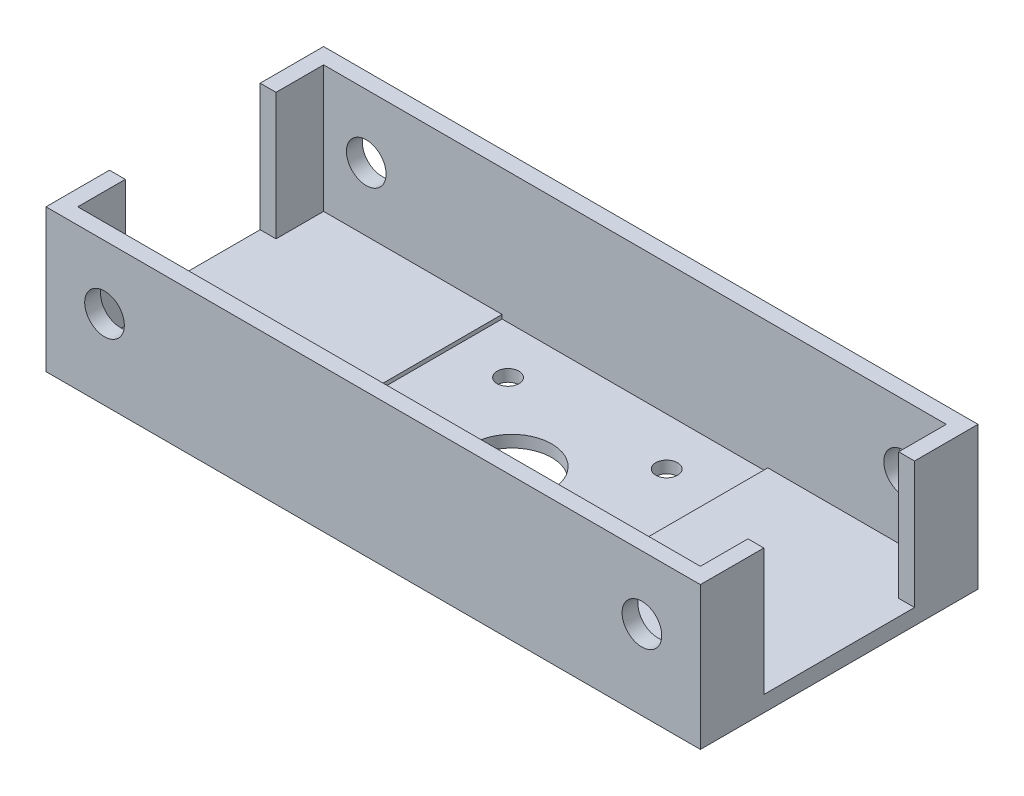
ISO-10303-21;
HEADER;
FILE_DESCRIPTION(('STEP AP214'),'2;1');
FILE_NAME('part.step','',(''),(''),'','','');
FILE_SCHEMA(('AUTOMOTIVE_DESIGN { 1 0 10303 214 1 1 1 1 }'));
ENDSEC;
DATA;
#1=APPLICATION_CONTEXT('core data for automotive mechanical design processes');
#2=APPLICATION_PROTOCOL_DEFINITION('international standard','automotive_design',2000,#1);
#3=PRODUCT_CONTEXT('',#1,'mechanical');
#4=PRODUCT('Part','Part','',(#3));
#5=PRODUCT_RELATED_PRODUCT_CATEGORY('part','',(#4));
#6=PRODUCT_DEFINITION_FORMATION('','',#4);
#7=PRODUCT_DEFINITION_CONTEXT('part definition',#1,'design');
#8=PRODUCT_DEFINITION('design','',#6,#7);
#9=PRODUCT_DEFINITION_SHAPE('','',#8);
#10=(LENGTH_UNIT() NAMED_UNIT(*) SI_UNIT(.MILLI.,.METRE.));
#11=(NAMED_UNIT(*) PLANE_ANGLE_UNIT() SI_UNIT($,.RADIAN.));
#12=(NAMED_UNIT(*) SI_UNIT($,.STERADIAN.) SOLID_ANGLE_UNIT());
#13=UNCERTAINTY_MEASURE_WITH_UNIT(LENGTH_MEASURE(1.E-05),#10,'distance_accuracy_value','');
#14=(GEOMETRIC_REPRESENTATION_CONTEXT(3) GLOBAL_UNCERTAINTY_ASSIGNED_CONTEXT((#13)) GLOBAL_UNIT_ASSIGNED_CONTEXT((#10,
#11,#12)) REPRESENTATION_CONTEXT('',''));
#15=CARTESIAN_POINT('',(0.,0.,0.));
#16=DIRECTION('',(0.,0.,1.));
#17=DIRECTION('',(1.,0.,0.));
#18=AXIS2_PLACEMENT_3D('',#15,#16,#17);
#19=CARTESIAN_POINT('',(0.,83.,0.));
#20=DIRECTION('',(0.,-1.,0.));
#21=DIRECTION('',(0.,0.,-1.));
#22=AXIS2_PLACEMENT_3D('',#19,#20,#21);
#23=PLANE('',#22);
#24=CARTESIAN_POINT('',(20.,83.,-19.));
#25=DIRECTION('',(0.,1.,0.));
#26=DIRECTION('',(0.,0.,-1.));
#27=AXIS2_PLACEMENT_3D('',#24,#25,#26);
#28=CIRCLE('',#27,2.75);
#29=CARTESIAN_POINT('',(20.,83.,-21.75));
#30=VERTEX_POINT('',#29);
#31=EDGE_CURVE('E887',#30,#30,#28,.T.);
#32=ORIENTED_EDGE('',*,*,#31,.F.);
#33=EDGE_LOOP('',(#32));
#34=FACE_BOUND('',#33,.T.);
#35=CARTESIAN_POINT('',(20.,83.,19.));
#36=DIRECTION('',(0.,1.,0.));
#37=DIRECTION('',(0.,0.,-1.));
#38=AXIS2_PLACEMENT_3D('',#35,#36,#37);
#39=CIRCLE('',#38,2.75);
#40=CARTESIAN_POINT('',(20.,83.,16.25));
#41=VERTEX_POINT('',#40);
#42=EDGE_CURVE('E895',#41,#41,#39,.T.);
#43=ORIENTED_EDGE('',*,*,#42,.F.);
#44=EDGE_LOOP('',(#43));
#45=FACE_BOUND('',#44,.T.);
#46=CARTESIAN_POINT('',(-20.,83.,-19.));
#47=DIRECTION('',(0.,1.,0.));
#48=DIRECTION('',(0.,0.,1.));
#49=AXIS2_PLACEMENT_3D('',#46,#47,#48);
#50=CIRCLE('',#49,2.75);
#51=CARTESIAN_POINT('',(-20.,83.,-16.25));
#52=VERTEX_POINT('',#51);
#53=EDGE_CURVE('E903',#52,#52,#50,.T.);
#54=ORIENTED_EDGE('',*,*,#53,.F.);
#55=EDGE_LOOP('',(#54));
#56=FACE_BOUND('',#55,.T.);
#57=CARTESIAN_POINT('',(-20.,83.,19.));
#58=DIRECTION('',(0.,1.,0.));
#59=DIRECTION('',(0.,0.,1.));
#60=AXIS2_PLACEMENT_3D('',#57,#58,#59);
#61=CIRCLE('',#60,2.75);
#62=CARTESIAN_POINT('',(-20.,83.,21.75));
#63=VERTEX_POINT('',#62);
#64=EDGE_CURVE('E841',#63,#63,#61,.T.);
#65=ORIENTED_EDGE('',*,*,#64,.F.);
#66=EDGE_LOOP('',(#65));
#67=FACE_BOUND('',#66,.T.);
#68=DIRECTION('',(0.,0.,-1.));
#69=VECTOR('',#68,1.);
#70=CARTESIAN_POINT('',(-33.5,83.,31.));
#71=LINE('',#70,#69);
#72=CARTESIAN_POINT('',(-33.5,83.,31.));
#73=VERTEX_POINT('',#72);
#74=CARTESIAN_POINT('',(-33.5,83.,-31.));
#75=VERTEX_POINT('',#74);
#76=EDGE_CURVE('E63',#73,#75,#71,.T.);
#77=ORIENTED_EDGE('',*,*,#76,.F.);
#78=DIRECTION('',(-1.,0.,0.));
#79=VECTOR('',#78,1.);
#80=CARTESIAN_POINT('',(-33.5,83.,31.));
#81=LINE('',#80,#79);
#82=CARTESIAN_POINT('',(33.5,83.,31.));
#83=VERTEX_POINT('',#82);
#84=EDGE_CURVE('E517',#83,#73,#81,.T.);
#85=ORIENTED_EDGE('',*,*,#84,.F.);
#86=DIRECTION('',(0.,0.,1.));
#87=VECTOR('',#86,1.);
#88=CARTESIAN_POINT('',(33.5,83.,31.));
#89=LINE('',#88,#87);
#90=CARTESIAN_POINT('',(33.5,83.,-31.));
#91=VERTEX_POINT('',#90);
#92=EDGE_CURVE('E186',#91,#83,#89,.T.);
#93=ORIENTED_EDGE('',*,*,#92,.F.);
#94=DIRECTION('',(1.,0.,0.));
#95=VECTOR('',#94,1.);
#96=CARTESIAN_POINT('',(-33.5,83.,-31.));
#97=LINE('',#96,#95);
#98=EDGE_CURVE('E183',#75,#91,#97,.T.);
#99=ORIENTED_EDGE('',*,*,#98,.F.);
#100=EDGE_LOOP('',(#77,#85,#93,#99));
#101=FACE_BOUND('',#100,.T.);
#102=CARTESIAN_POINT('',(0.,83.,0.));
#103=DIRECTION('',(0.,1.,0.));
#104=DIRECTION('',(0.,0.,1.));
#105=AXIS2_PLACEMENT_3D('',#102,#103,#104);
#106=CIRCLE('',#105,10.);
#107=CARTESIAN_POINT('',(0.,83.,10.));
#108=VERTEX_POINT('',#107);
#109=EDGE_CURVE('E839',#108,#108,#106,.T.);
#110=ORIENTED_EDGE('',*,*,#109,.F.);
#111=EDGE_LOOP('',(#110));
#112=FACE_BOUND('',#111,.T.);
#113=ADVANCED_FACE('F47',(#34,#45,#56,#67,#101,#112),#23,.F.);
#114=CARTESIAN_POINT('',(-33.5,0.,-14.));
#115=DIRECTION('',(-1.,0.,0.));
#116=DIRECTION('',(0.,0.,1.));
#117=AXIS2_PLACEMENT_3D('',#114,#115,#116);
#118=PLANE('',#117);
#119=ORIENTED_EDGE('',*,*,#76,.T.);
#120=DIRECTION('',(0.,-1.,0.));
#121=VECTOR('',#120,1.);
#122=CARTESIAN_POINT('',(-33.5,113.,-31.));
#123=LINE('',#122,#121);
#124=CARTESIAN_POINT('',(-33.5,84.,-31.));
#125=VERTEX_POINT('',#124);
#126=EDGE_CURVE('E197',#125,#75,#123,.T.);
#127=ORIENTED_EDGE('',*,*,#126,.F.);
#128=DIRECTION('',(0.,0.,-1.));
#129=VECTOR('',#128,1.);
#130=CARTESIAN_POINT('',(-33.5,84.,-31.));
#131=LINE('',#130,#129);
#132=CARTESIAN_POINT('',(-33.5,84.,31.));
#133=VERTEX_POINT('',#132);
#134=EDGE_CURVE('E350',#133,#125,#131,.T.);
#135=ORIENTED_EDGE('',*,*,#134,.F.);
#136=DIRECTION('',(0.,-1.,0.));
#137=VECTOR('',#136,1.);
#138=CARTESIAN_POINT('',(-33.5,113.,31.));
#139=LINE('',#138,#137);
#140=EDGE_CURVE('E199',#133,#73,#139,.T.);
#141=ORIENTED_EDGE('',*,*,#140,.T.);
#142=EDGE_LOOP('',(#119,#127,#135,#141));
#143=FACE_BOUND('',#142,.T.);
#144=ADVANCED_FACE('F49',(#143),#118,.F.);
#145=CARTESIAN_POINT('',(33.5,0.,-14.));
#146=DIRECTION('',(1.,0.,0.));
#147=DIRECTION('',(0.,0.,-1.));
#148=AXIS2_PLACEMENT_3D('',#145,#146,#147);
#149=PLANE('',#148);
#150=ORIENTED_EDGE('',*,*,#92,.T.);
#151=DIRECTION('',(0.,-1.,0.));
#152=VECTOR('',#151,1.);
#153=CARTESIAN_POINT('',(33.5,113.,31.));
#154=LINE('',#153,#152);
#155=CARTESIAN_POINT('',(33.5,84.,31.));
#156=VERTEX_POINT('',#155);
#157=EDGE_CURVE('E208',#156,#83,#154,.T.);
#158=ORIENTED_EDGE('',*,*,#157,.F.);
#159=DIRECTION('',(0.,0.,1.));
#160=VECTOR('',#159,1.);
#161=CARTESIAN_POINT('',(33.5,84.,31.));
#162=LINE('',#161,#160);
#163=CARTESIAN_POINT('',(33.5,84.,-31.));
#164=VERTEX_POINT('',#163);
#165=EDGE_CURVE('E353',#164,#156,#162,.T.);
#166=ORIENTED_EDGE('',*,*,#165,.F.);
#167=DIRECTION('',(0.,-1.,0.));
#168=VECTOR('',#167,1.);
#169=CARTESIAN_POINT('',(33.5,113.,-31.));
#170=LINE('',#169,#168);
#171=EDGE_CURVE('E209',#164,#91,#170,.T.);
#172=ORIENTED_EDGE('',*,*,#171,.T.);
#173=EDGE_LOOP('',(#150,#158,#166,#172));
#174=FACE_BOUND('',#173,.T.);
#175=ADVANCED_FACE('F463',(#174),#149,.F.);
#176=CARTESIAN_POINT('',(33.5,113.,-31.));
#177=DIRECTION('',(0.,0.,1.));
#178=DIRECTION('',(1.,0.,0.));
#179=AXIS2_PLACEMENT_3D('',#176,#177,#178);
#180=PLANE('',#179);
#181=CARTESIAN_POINT('',(-67.75,100.,-31.));
#182=DIRECTION('',(0.,0.,1.));
#183=DIRECTION('',(1.,0.,0.));
#184=AXIS2_PLACEMENT_3D('',#181,#182,#183);
#185=CIRCLE('',#184,5.00000000000001);
#186=CARTESIAN_POINT('',(-62.75,100.,-31.));
#187=VERTEX_POINT('',#186);
#188=EDGE_CURVE('E229',#187,#187,#185,.F.);
#189=ORIENTED_EDGE('',*,*,#188,.T.);
#190=EDGE_LOOP('',(#189));
#191=FACE_BOUND('',#190,.T.);
#192=CARTESIAN_POINT('',(67.75,100.,-31.));
#193=DIRECTION('',(0.,0.,1.));
#194=DIRECTION('',(1.,0.,0.));
#195=AXIS2_PLACEMENT_3D('',#192,#193,#194);
#196=CIRCLE('',#195,5.00000000000001);
#197=CARTESIAN_POINT('',(72.75,100.,-31.));
#198=VERTEX_POINT('',#197);
#199=EDGE_CURVE('E223',#198,#198,#196,.T.);
#200=ORIENTED_EDGE('',*,*,#199,.F.);
#201=EDGE_LOOP('',(#200));
#202=FACE_BOUND('',#201,.T.);
#203=ORIENTED_EDGE('',*,*,#126,.T.);
#204=ORIENTED_EDGE('',*,*,#98,.T.);
#205=ORIENTED_EDGE('',*,*,#171,.F.);
#206=DIRECTION('',(-1.,0.,0.));
#207=VECTOR('',#206,1.);
#208=CARTESIAN_POINT('',(33.5,84.,-31.));
#209=LINE('',#208,#207);
#210=CARTESIAN_POINT('',(78.5,84.,-31.));
#211=VERTEX_POINT('',#210);
#212=EDGE_CURVE('E373',#211,#164,#209,.T.);
#213=ORIENTED_EDGE('',*,*,#212,.F.);
#214=DIRECTION('',(0.,1.,0.));
#215=VECTOR('',#214,1.);
#216=CARTESIAN_POINT('',(78.5,84.,-31.));
#217=LINE('',#216,#215);
#218=CARTESIAN_POINT('',(78.5,116.,-31.));
#219=VERTEX_POINT('',#218);
#220=EDGE_CURVE('E346',#211,#219,#217,.T.);
#221=ORIENTED_EDGE('',*,*,#220,.T.);
#222=DIRECTION('',(-1.,0.,0.));
#223=VECTOR('',#222,1.);
#224=CARTESIAN_POINT('',(-78.5,116.,-31.));
#225=LINE('',#224,#223);
#226=CARTESIAN_POINT('',(-78.5,116.,-31.));
#227=VERTEX_POINT('',#226);
#228=EDGE_CURVE('E276',#219,#227,#225,.T.);
#229=ORIENTED_EDGE('',*,*,#228,.T.);
#230=DIRECTION('',(0.,1.,0.));
#231=VECTOR('',#230,1.);
#232=CARTESIAN_POINT('',(-78.5,84.,-31.));
#233=LINE('',#232,#231);
#234=CARTESIAN_POINT('',(-78.5,84.,-31.));
#235=VERTEX_POINT('',#234);
#236=EDGE_CURVE('E258',#235,#227,#233,.T.);
#237=ORIENTED_EDGE('',*,*,#236,.F.);
#238=DIRECTION('',(-1.,0.,0.));
#239=VECTOR('',#238,1.);
#240=CARTESIAN_POINT('',(-33.5,84.,-31.));
#241=LINE('',#240,#239);
#242=EDGE_CURVE('E206',#125,#235,#241,.T.);
#243=ORIENTED_EDGE('',*,*,#242,.F.);
#244=EDGE_LOOP('',(#203,#204,#205,#213,#221,#229,#237,#243));
#245=FACE_BOUND('',#244,.T.);
#246=ADVANCED_FACE('F204',(#191,#202,#245),#180,.T.);
#247=CARTESIAN_POINT('',(-33.5,113.,31.));
#248=DIRECTION('',(0.,0.,-1.));
#249=DIRECTION('',(-1.,0.,0.));
#250=AXIS2_PLACEMENT_3D('',#247,#248,#249);
#251=PLANE('',#250);
#252=CARTESIAN_POINT('',(-67.75,100.,31.));
#253=DIRECTION('',(0.,0.,-1.));
#254=DIRECTION('',(-1.,0.,0.));
#255=AXIS2_PLACEMENT_3D('',#252,#253,#254);
#256=CIRCLE('',#255,5.00000000000001);
#257=CARTESIAN_POINT('',(-72.75,100.,31.));
#258=VERTEX_POINT('',#257);
#259=EDGE_CURVE('E225',#258,#258,#256,.F.);
#260=ORIENTED_EDGE('',*,*,#259,.T.);
#261=EDGE_LOOP('',(#260));
#262=FACE_BOUND('',#261,.T.);
#263=CARTESIAN_POINT('',(67.75,100.,31.));
#264=DIRECTION('',(0.,0.,-1.));
#265=DIRECTION('',(-1.,0.,0.));
#266=AXIS2_PLACEMENT_3D('',#263,#264,#265);
#267=CIRCLE('',#266,5.00000000000001);
#268=CARTESIAN_POINT('',(62.75,100.,31.));
#269=VERTEX_POINT('',#268);
#270=EDGE_CURVE('E219',#269,#269,#267,.T.);
#271=ORIENTED_EDGE('',*,*,#270,.F.);
#272=EDGE_LOOP('',(#271));
#273=FACE_BOUND('',#272,.T.);
#274=ORIENTED_EDGE('',*,*,#157,.T.);
#275=ORIENTED_EDGE('',*,*,#84,.T.);
#276=ORIENTED_EDGE('',*,*,#140,.F.);
#277=DIRECTION('',(1.,0.,0.));
#278=VECTOR('',#277,1.);
#279=CARTESIAN_POINT('',(-33.5,84.,31.));
#280=LINE('',#279,#278);
#281=CARTESIAN_POINT('',(-78.5,84.,31.));
#282=VERTEX_POINT('',#281);
#283=EDGE_CURVE('E360',#282,#133,#280,.T.);
#284=ORIENTED_EDGE('',*,*,#283,.F.);
#285=DIRECTION('',(0.,1.,0.));
#286=VECTOR('',#285,1.);
#287=CARTESIAN_POINT('',(-78.5,84.,31.));
#288=LINE('',#287,#286);
#289=CARTESIAN_POINT('',(-78.5,116.,31.));
#290=VERTEX_POINT('',#289);
#291=EDGE_CURVE('E363',#282,#290,#288,.T.);
#292=ORIENTED_EDGE('',*,*,#291,.T.);
#293=DIRECTION('',(1.,0.,0.));
#294=VECTOR('',#293,1.);
#295=CARTESIAN_POINT('',(-78.5,116.,31.));
#296=LINE('',#295,#294);
#297=CARTESIAN_POINT('',(78.5,116.,31.));
#298=VERTEX_POINT('',#297);
#299=EDGE_CURVE('E261',#290,#298,#296,.T.);
#300=ORIENTED_EDGE('',*,*,#299,.T.);
#301=DIRECTION('',(0.,1.,0.));
#302=VECTOR('',#301,1.);
#303=CARTESIAN_POINT('',(78.5,84.,31.));
#304=LINE('',#303,#302);
#305=CARTESIAN_POINT('',(78.5,84.,31.));
#306=VERTEX_POINT('',#305);
#307=EDGE_CURVE('E370',#306,#298,#304,.T.);
#308=ORIENTED_EDGE('',*,*,#307,.F.);
#309=DIRECTION('',(1.,0.,0.));
#310=VECTOR('',#309,1.);
#311=CARTESIAN_POINT('',(33.5,84.,31.));
#312=LINE('',#311,#310);
#313=EDGE_CURVE('E384',#156,#306,#312,.T.);
#314=ORIENTED_EDGE('',*,*,#313,.F.);
#315=EDGE_LOOP('',(#274,#275,#276,#284,#292,#300,#308,#314));
#316=FACE_BOUND('',#315,.T.);
#317=ADVANCED_FACE('F431',(#262,#273,#316),#251,.T.);
#318=CARTESIAN_POINT('',(-82.5,0.,0.));
#319=DIRECTION('',(-1.,0.,0.));
#320=DIRECTION('',(0.,0.,1.));
#321=AXIS2_PLACEMENT_3D('',#318,#319,#320);
#322=PLANE('',#321);
#323=DIRECTION('',(0.,0.,1.));
#324=VECTOR('',#323,1.);
#325=CARTESIAN_POINT('',(-82.5,116.,-35.));
#326=LINE('',#325,#324);
#327=CARTESIAN_POINT('',(-82.5,116.,19.));
#328=VERTEX_POINT('',#327);
#329=CARTESIAN_POINT('',(-82.5,116.,35.));
#330=VERTEX_POINT('',#329);
#331=EDGE_CURVE('E279',#328,#330,#326,.T.);
#332=ORIENTED_EDGE('',*,*,#331,.F.);
#333=DIRECTION('',(0.,1.,0.));
#334=VECTOR('',#333,1.);
#335=CARTESIAN_POINT('',(-82.5,84.,19.));
#336=LINE('',#335,#334);
#337=CARTESIAN_POINT('',(-82.5,84.,19.));
#338=VERTEX_POINT('',#337);
#339=EDGE_CURVE('E71',#338,#328,#336,.T.);
#340=ORIENTED_EDGE('',*,*,#339,.F.);
#341=DIRECTION('',(0.,0.,1.));
#342=VECTOR('',#341,1.);
#343=CARTESIAN_POINT('',(-82.5,84.,-19.));
#344=LINE('',#343,#342);
#345=CARTESIAN_POINT('',(-82.5,84.,-19.));
#346=VERTEX_POINT('',#345);
#347=EDGE_CURVE('E309',#346,#338,#344,.T.);
#348=ORIENTED_EDGE('',*,*,#347,.F.);
#349=DIRECTION('',(0.,-1.,0.));
#350=VECTOR('',#349,1.);
#351=CARTESIAN_POINT('',(-82.5,84.,-19.));
#352=LINE('',#351,#350);
#353=CARTESIAN_POINT('',(-82.5,116.,-19.));
#354=VERTEX_POINT('',#353);
#355=EDGE_CURVE('E294',#354,#346,#352,.T.);
#356=ORIENTED_EDGE('',*,*,#355,.F.);
#357=CARTESIAN_POINT('',(-82.5,116.,-35.));
#358=VERTEX_POINT('',#357);
#359=EDGE_CURVE('E250',#358,#354,#326,.T.);
#360=ORIENTED_EDGE('',*,*,#359,.F.);
#361=DIRECTION('',(0.,-1.,0.));
#362=VECTOR('',#361,1.);
#363=CARTESIAN_POINT('',(-82.5,113.,-35.));
#364=LINE('',#363,#362);
#365=CARTESIAN_POINT('',(-82.5,80.,-35.));
#366=VERTEX_POINT('',#365);
#367=EDGE_CURVE('E396',#358,#366,#364,.T.);
#368=ORIENTED_EDGE('',*,*,#367,.T.);
#369=DIRECTION('',(0.,0.,1.));
#370=VECTOR('',#369,1.);
#371=CARTESIAN_POINT('',(-82.5,80.,-35.));
#372=LINE('',#371,#370);
#373=CARTESIAN_POINT('',(-82.5,80.,35.));
#374=VERTEX_POINT('',#373);
#375=EDGE_CURVE('E339',#366,#374,#372,.T.);
#376=ORIENTED_EDGE('',*,*,#375,.T.);
#377=DIRECTION('',(0.,1.,0.));
#378=VECTOR('',#377,1.);
#379=CARTESIAN_POINT('',(-82.5,113.,35.));
#380=LINE('',#379,#378);
#381=EDGE_CURVE('E215',#374,#330,#380,.T.);
#382=ORIENTED_EDGE('',*,*,#381,.T.);
#383=EDGE_LOOP('',(#332,#340,#348,#356,#360,#368,#376,#382));
#384=FACE_BOUND('',#383,.T.);
#385=ADVANCED_FACE('F407',(#384),#322,.T.);
#386=CARTESIAN_POINT('',(-78.5,84.,-31.));
#387=DIRECTION('',(-1.,0.,0.));
#388=DIRECTION('',(0.,0.,1.));
#389=AXIS2_PLACEMENT_3D('',#386,#387,#388);
#390=PLANE('',#389);
#391=DIRECTION('',(0.,1.,0.));
#392=VECTOR('',#391,1.);
#393=CARTESIAN_POINT('',(-78.5,84.,19.));
#394=LINE('',#393,#392);
#395=CARTESIAN_POINT('',(-78.5,84.,19.));
#396=VERTEX_POINT('',#395);
#397=CARTESIAN_POINT('',(-78.5,116.,19.));
#398=VERTEX_POINT('',#397);
#399=EDGE_CURVE('E318',#396,#398,#394,.T.);
#400=ORIENTED_EDGE('',*,*,#399,.T.);
#401=DIRECTION('',(0.,0.,1.));
#402=VECTOR('',#401,1.);
#403=CARTESIAN_POINT('',(-78.5,116.,-31.));
#404=LINE('',#403,#402);
#405=EDGE_CURVE('E262',#398,#290,#404,.T.);
#406=ORIENTED_EDGE('',*,*,#405,.T.);
#407=ORIENTED_EDGE('',*,*,#291,.F.);
#408=DIRECTION('',(0.,0.,1.));
#409=VECTOR('',#408,1.);
#410=CARTESIAN_POINT('',(-78.5,84.,-31.));
#411=LINE('',#410,#409);
#412=EDGE_CURVE('E356',#396,#282,#411,.T.);
#413=ORIENTED_EDGE('',*,*,#412,.F.);
#414=EDGE_LOOP('',(#400,#406,#407,#413));
#415=FACE_BOUND('',#414,.T.);
#416=ADVANCED_FACE('F435',(#415),#390,.F.);
#417=CARTESIAN_POINT('',(-78.5,116.,-19.));
#418=VERTEX_POINT('',#417);
#419=EDGE_CURVE('E247',#227,#418,#404,.T.);
#420=ORIENTED_EDGE('',*,*,#419,.T.);
#421=DIRECTION('',(0.,-1.,0.));
#422=VECTOR('',#421,1.);
#423=CARTESIAN_POINT('',(-78.5,84.,-19.));
#424=LINE('',#423,#422);
#425=CARTESIAN_POINT('',(-78.5,84.,-19.));
#426=VERTEX_POINT('',#425);
#427=EDGE_CURVE('E256',#418,#426,#424,.T.);
#428=ORIENTED_EDGE('',*,*,#427,.T.);
#429=EDGE_CURVE('E357',#235,#426,#411,.T.);
#430=ORIENTED_EDGE('',*,*,#429,.F.);
#431=ORIENTED_EDGE('',*,*,#236,.T.);
#432=EDGE_LOOP('',(#420,#428,#430,#431));
#433=FACE_BOUND('',#432,.T.);
#434=ADVANCED_FACE('F254',(#433),#390,.F.);
#435=CARTESIAN_POINT('',(0.,116.,0.));
#436=DIRECTION('',(0.,1.,0.));
#437=DIRECTION('',(0.,0.,1.));
#438=AXIS2_PLACEMENT_3D('',#435,#436,#437);
#439=PLANE('',#438);
#440=ORIENTED_EDGE('',*,*,#405,.F.);
#441=DIRECTION('',(-1.,0.,0.));
#442=VECTOR('',#441,1.);
#443=CARTESIAN_POINT('',(0.,116.,19.));
#444=LINE('',#443,#442);
#445=EDGE_CURVE('E11',#398,#328,#444,.T.);
#446=ORIENTED_EDGE('',*,*,#445,.T.);
#447=ORIENTED_EDGE('',*,*,#331,.T.);
#448=DIRECTION('',(1.,0.,0.));
#449=VECTOR('',#448,1.);
#450=CARTESIAN_POINT('',(-82.5,116.,35.));
#451=LINE('',#450,#449);
#452=CARTESIAN_POINT('',(82.5,116.,35.));
#453=VERTEX_POINT('',#452);
#454=EDGE_CURVE('E282',#330,#453,#451,.T.);
#455=ORIENTED_EDGE('',*,*,#454,.T.);
#456=DIRECTION('',(0.,0.,-1.));
#457=VECTOR('',#456,1.);
#458=CARTESIAN_POINT('',(82.5,116.,-35.));
#459=LINE('',#458,#457);
#460=CARTESIAN_POINT('',(82.5,116.,19.));
#461=VERTEX_POINT('',#460);
#462=EDGE_CURVE('E287',#453,#461,#459,.T.);
#463=ORIENTED_EDGE('',*,*,#462,.T.);
#464=DIRECTION('',(1.,0.,0.));
#465=VECTOR('',#464,1.);
#466=CARTESIAN_POINT('',(0.,116.,19.));
#467=LINE('',#466,#465);
#468=CARTESIAN_POINT('',(78.5,116.,19.));
#469=VERTEX_POINT('',#468);
#470=EDGE_CURVE('E235',#469,#461,#467,.T.);
#471=ORIENTED_EDGE('',*,*,#470,.F.);
#472=DIRECTION('',(0.,0.,-1.));
#473=VECTOR('',#472,1.);
#474=CARTESIAN_POINT('',(78.5,116.,-31.));
#475=LINE('',#474,#473);
#476=EDGE_CURVE('E272',#298,#469,#475,.T.);
#477=ORIENTED_EDGE('',*,*,#476,.F.);
#478=ORIENTED_EDGE('',*,*,#299,.F.);
#479=EDGE_LOOP('',(#440,#446,#447,#455,#463,#471,#477,#478));
#480=FACE_BOUND('',#479,.T.);
#481=ADVANCED_FACE('F415',(#480),#439,.T.);
#482=ORIENTED_EDGE('',*,*,#359,.T.);
#483=DIRECTION('',(1.,0.,0.));
#484=VECTOR('',#483,1.);
#485=CARTESIAN_POINT('',(0.,116.,-19.));
#486=LINE('',#485,#484);
#487=EDGE_CURVE('E56',#354,#418,#486,.T.);
#488=ORIENTED_EDGE('',*,*,#487,.T.);
#489=ORIENTED_EDGE('',*,*,#419,.F.);
#490=ORIENTED_EDGE('',*,*,#228,.F.);
#491=CARTESIAN_POINT('',(78.5,116.,-19.));
#492=VERTEX_POINT('',#491);
#493=EDGE_CURVE('E267',#492,#219,#475,.T.);
#494=ORIENTED_EDGE('',*,*,#493,.F.);
#495=DIRECTION('',(-1.,0.,0.));
#496=VECTOR('',#495,1.);
#497=CARTESIAN_POINT('',(0.,116.,-19.));
#498=LINE('',#497,#496);
#499=CARTESIAN_POINT('',(82.5,116.,-19.));
#500=VERTEX_POINT('',#499);
#501=EDGE_CURVE('E231',#500,#492,#498,.T.);
#502=ORIENTED_EDGE('',*,*,#501,.F.);
#503=CARTESIAN_POINT('',(82.5,116.,-35.));
#504=VERTEX_POINT('',#503);
#505=EDGE_CURVE('E286',#500,#504,#459,.T.);
#506=ORIENTED_EDGE('',*,*,#505,.T.);
#507=DIRECTION('',(-1.,0.,0.));
#508=VECTOR('',#507,1.);
#509=CARTESIAN_POINT('',(-82.5,116.,-35.));
#510=LINE('',#509,#508);
#511=EDGE_CURVE('E291',#504,#358,#510,.T.);
#512=ORIENTED_EDGE('',*,*,#511,.T.);
#513=EDGE_LOOP('',(#482,#488,#489,#490,#494,#502,#506,#512));
#514=FACE_BOUND('',#513,.T.);
#515=ADVANCED_FACE('F245',(#514),#439,.T.);
#516=CARTESIAN_POINT('',(78.5,84.,31.));
#517=DIRECTION('',(1.,0.,0.));
#518=DIRECTION('',(0.,0.,-1.));
#519=AXIS2_PLACEMENT_3D('',#516,#517,#518);
#520=PLANE('',#519);
#521=ORIENTED_EDGE('',*,*,#476,.T.);
#522=DIRECTION('',(0.,-1.,0.));
#523=VECTOR('',#522,1.);
#524=CARTESIAN_POINT('',(78.5,84.,19.));
#525=LINE('',#524,#523);
#526=CARTESIAN_POINT('',(78.5,84.,19.));
#527=VERTEX_POINT('',#526);
#528=EDGE_CURVE('E325',#469,#527,#525,.T.);
#529=ORIENTED_EDGE('',*,*,#528,.T.);
#530=DIRECTION('',(0.,0.,-1.));
#531=VECTOR('',#530,1.);
#532=CARTESIAN_POINT('',(78.5,84.,31.));
#533=LINE('',#532,#531);
#534=EDGE_CURVE('E380',#306,#527,#533,.T.);
#535=ORIENTED_EDGE('',*,*,#534,.F.);
#536=ORIENTED_EDGE('',*,*,#307,.T.);
#537=EDGE_LOOP('',(#521,#529,#535,#536));
#538=FACE_BOUND('',#537,.T.);
#539=ADVANCED_FACE('F427',(#538),#520,.F.);
#540=CARTESIAN_POINT('',(0.,84.,0.));
#541=DIRECTION('',(0.,-1.,0.));
#542=DIRECTION('',(0.,0.,-1.));
#543=AXIS2_PLACEMENT_3D('',#540,#541,#542);
#544=PLANE('',#543);
#545=ORIENTED_EDGE('',*,*,#165,.T.);
#546=ORIENTED_EDGE('',*,*,#313,.T.);
#547=ORIENTED_EDGE('',*,*,#534,.T.);
#548=DIRECTION('',(-1.,0.,0.));
#549=VECTOR('',#548,1.);
#550=CARTESIAN_POINT('',(82.5,84.,19.));
#551=LINE('',#550,#549);
#552=CARTESIAN_POINT('',(82.5,84.,19.));
#553=VERTEX_POINT('',#552);
#554=EDGE_CURVE('E315',#553,#527,#551,.T.);
#555=ORIENTED_EDGE('',*,*,#554,.F.);
#556=DIRECTION('',(0.,0.,1.));
#557=VECTOR('',#556,1.);
#558=CARTESIAN_POINT('',(82.5,84.,-19.));
#559=LINE('',#558,#557);
#560=CARTESIAN_POINT('',(82.5,84.,-19.));
#561=VERTEX_POINT('',#560);
#562=EDGE_CURVE('E299',#561,#553,#559,.T.);
#563=ORIENTED_EDGE('',*,*,#562,.F.);
#564=DIRECTION('',(-1.,0.,0.));
#565=VECTOR('',#564,1.);
#566=CARTESIAN_POINT('',(82.5,84.,-19.));
#567=LINE('',#566,#565);
#568=CARTESIAN_POINT('',(78.5,84.,-19.));
#569=VERTEX_POINT('',#568);
#570=EDGE_CURVE('E320',#561,#569,#567,.T.);
#571=ORIENTED_EDGE('',*,*,#570,.T.);
#572=EDGE_CURVE('E379',#569,#211,#533,.T.);
#573=ORIENTED_EDGE('',*,*,#572,.T.);
#574=ORIENTED_EDGE('',*,*,#212,.T.);
#575=EDGE_LOOP('',(#545,#546,#547,#555,#563,#571,#573,#574));
#576=FACE_BOUND('',#575,.T.);
#577=ADVANCED_FACE('F492',(#576),#544,.F.);
#578=CARTESIAN_POINT('',(0.,0.,35.));
#579=DIRECTION('',(0.,0.,1.));
#580=DIRECTION('',(1.,0.,0.));
#581=AXIS2_PLACEMENT_3D('',#578,#579,#580);
#582=PLANE('',#581);
#583=DIRECTION('',(-1.,0.,0.));
#584=VECTOR('',#583,1.);
#585=CARTESIAN_POINT('',(-82.5,80.,35.));
#586=LINE('',#585,#584);
#587=CARTESIAN_POINT('',(82.5,80.,35.));
#588=VERTEX_POINT('',#587);
#589=EDGE_CURVE('E340',#588,#374,#586,.T.);
#590=ORIENTED_EDGE('',*,*,#589,.F.);
#591=DIRECTION('',(0.,1.,0.));
#592=VECTOR('',#591,1.);
#593=CARTESIAN_POINT('',(82.5,113.,35.));
#594=LINE('',#593,#592);
#595=EDGE_CURVE('E393',#588,#453,#594,.T.);
#596=ORIENTED_EDGE('',*,*,#595,.T.);
#597=ORIENTED_EDGE('',*,*,#454,.F.);
#598=ORIENTED_EDGE('',*,*,#381,.F.);
#599=EDGE_LOOP('',(#590,#596,#597,#598));
#600=FACE_BOUND('',#599,.T.);
#601=CARTESIAN_POINT('',(-67.75,100.,35.));
#602=DIRECTION('',(0.,0.,-1.));
#603=DIRECTION('',(-1.,0.,0.));
#604=AXIS2_PLACEMENT_3D('',#601,#602,#603);
#605=CIRCLE('',#604,5.00000000000001);
#606=CARTESIAN_POINT('',(-72.75,100.,35.));
#607=VERTEX_POINT('',#606);
#608=EDGE_CURVE('E853',#607,#607,#605,.T.);
#609=ORIENTED_EDGE('',*,*,#608,.T.);
#610=EDGE_LOOP('',(#609));
#611=FACE_BOUND('',#610,.T.);
#612=CARTESIAN_POINT('',(67.75,100.,35.));
#613=DIRECTION('',(0.,0.,1.));
#614=DIRECTION('',(1.,0.,0.));
#615=AXIS2_PLACEMENT_3D('',#612,#613,#614);
#616=CIRCLE('',#615,5.00000000000001);
#617=CARTESIAN_POINT('',(72.75,100.,35.));
#618=VERTEX_POINT('',#617);
#619=EDGE_CURVE('E863',#618,#618,#616,.T.);
#620=ORIENTED_EDGE('',*,*,#619,.F.);
#621=EDGE_LOOP('',(#620));
#622=FACE_BOUND('',#621,.T.);
#623=ADVANCED_FACE('F409',(#600,#611,#622),#582,.T.);
#624=CARTESIAN_POINT('',(0.,0.,-35.));
#625=DIRECTION('',(0.,0.,-1.));
#626=DIRECTION('',(-1.,0.,0.));
#627=AXIS2_PLACEMENT_3D('',#624,#625,#626);
#628=PLANE('',#627);
#629=DIRECTION('',(0.,-1.,0.));
#630=VECTOR('',#629,1.);
#631=CARTESIAN_POINT('',(82.5,113.,-35.));
#632=LINE('',#631,#630);
#633=CARTESIAN_POINT('',(82.5,80.,-35.));
#634=VERTEX_POINT('',#633);
#635=EDGE_CURVE('E367',#504,#634,#632,.T.);
#636=ORIENTED_EDGE('',*,*,#635,.T.);
#637=DIRECTION('',(-1.,0.,0.));
#638=VECTOR('',#637,1.);
#639=CARTESIAN_POINT('',(-82.5,80.,-35.));
#640=LINE('',#639,#638);
#641=EDGE_CURVE('E335',#634,#366,#640,.T.);
#642=ORIENTED_EDGE('',*,*,#641,.T.);
#643=ORIENTED_EDGE('',*,*,#367,.F.);
#644=ORIENTED_EDGE('',*,*,#511,.F.);
#645=EDGE_LOOP('',(#636,#642,#643,#644));
#646=FACE_BOUND('',#645,.T.);
#647=CARTESIAN_POINT('',(-67.75,100.,-35.));
#648=DIRECTION('',(0.,0.,-1.));
#649=DIRECTION('',(-1.,0.,0.));
#650=AXIS2_PLACEMENT_3D('',#647,#648,#649);
#651=CIRCLE('',#650,5.00000000000001);
#652=CARTESIAN_POINT('',(-72.75,100.,-35.));
#653=VERTEX_POINT('',#652);
#654=EDGE_CURVE('E230',#653,#653,#651,.T.);
#655=ORIENTED_EDGE('',*,*,#654,.F.);
#656=EDGE_LOOP('',(#655));
#657=FACE_BOUND('',#656,.T.);
#658=CARTESIAN_POINT('',(67.75,100.,-35.));
#659=DIRECTION('',(0.,0.,1.));
#660=DIRECTION('',(1.,0.,0.));
#661=AXIS2_PLACEMENT_3D('',#658,#659,#660);
#662=CIRCLE('',#661,5.00000000000001);
#663=CARTESIAN_POINT('',(72.75,100.,-35.));
#664=VERTEX_POINT('',#663);
#665=EDGE_CURVE('E224',#664,#664,#662,.T.);
#666=ORIENTED_EDGE('',*,*,#665,.T.);
#667=EDGE_LOOP('',(#666));
#668=FACE_BOUND('',#667,.T.);
#669=ADVANCED_FACE('F498',(#646,#657,#668),#628,.T.);
#670=CARTESIAN_POINT('',(82.5,0.,0.));
#671=DIRECTION('',(1.,0.,0.));
#672=DIRECTION('',(0.,0.,1.));
#673=AXIS2_PLACEMENT_3D('',#670,#671,#672);
#674=PLANE('',#673);
#675=DIRECTION('',(0.,1.,0.));
#676=VECTOR('',#675,1.);
#677=CARTESIAN_POINT('',(82.5,84.,19.));
#678=LINE('',#677,#676);
#679=EDGE_CURVE('E303',#553,#461,#678,.T.);
#680=ORIENTED_EDGE('',*,*,#679,.T.);
#681=ORIENTED_EDGE('',*,*,#462,.F.);
#682=ORIENTED_EDGE('',*,*,#595,.F.);
#683=DIRECTION('',(0.,0.,1.));
#684=VECTOR('',#683,1.);
#685=CARTESIAN_POINT('',(82.5,80.,-35.));
#686=LINE('',#685,#684);
#687=EDGE_CURVE('E334',#634,#588,#686,.T.);
#688=ORIENTED_EDGE('',*,*,#687,.F.);
#689=ORIENTED_EDGE('',*,*,#635,.F.);
#690=ORIENTED_EDGE('',*,*,#505,.F.);
#691=DIRECTION('',(0.,-1.,0.));
#692=VECTOR('',#691,1.);
#693=CARTESIAN_POINT('',(82.5,84.,-19.));
#694=LINE('',#693,#692);
#695=EDGE_CURVE('E295',#500,#561,#694,.T.);
#696=ORIENTED_EDGE('',*,*,#695,.T.);
#697=ORIENTED_EDGE('',*,*,#562,.T.);
#698=EDGE_LOOP('',(#680,#681,#682,#688,#689,#690,#696,#697));
#699=FACE_BOUND('',#698,.T.);
#700=ADVANCED_FACE('F418',(#699),#674,.T.);
#701=DIRECTION('',(0.,1.,0.));
#702=VECTOR('',#701,1.);
#703=CARTESIAN_POINT('',(78.5,84.,-19.));
#704=LINE('',#703,#702);
#705=EDGE_CURVE('E331',#569,#492,#704,.T.);
#706=ORIENTED_EDGE('',*,*,#705,.T.);
#707=ORIENTED_EDGE('',*,*,#493,.T.);
#708=ORIENTED_EDGE('',*,*,#220,.F.);
#709=ORIENTED_EDGE('',*,*,#572,.F.);
#710=EDGE_LOOP('',(#706,#707,#708,#709));
#711=FACE_BOUND('',#710,.T.);
#712=ADVANCED_FACE('F488',(#711),#520,.F.);
#713=CARTESIAN_POINT('',(0.,84.,0.));
#714=DIRECTION('',(0.,-1.,0.));
#715=DIRECTION('',(0.,0.,-1.));
#716=AXIS2_PLACEMENT_3D('',#713,#714,#715);
#717=PLANE('',#716);
#718=ORIENTED_EDGE('',*,*,#134,.T.);
#719=ORIENTED_EDGE('',*,*,#242,.T.);
#720=ORIENTED_EDGE('',*,*,#429,.T.);
#721=EDGE_CURVE('E306',#426,#346,#567,.T.);
#722=ORIENTED_EDGE('',*,*,#721,.T.);
#723=ORIENTED_EDGE('',*,*,#347,.T.);
#724=EDGE_CURVE('E319',#396,#338,#551,.T.);
#725=ORIENTED_EDGE('',*,*,#724,.F.);
#726=ORIENTED_EDGE('',*,*,#412,.T.);
#727=ORIENTED_EDGE('',*,*,#283,.T.);
#728=EDGE_LOOP('',(#718,#719,#720,#722,#723,#725,#726,#727));
#729=FACE_BOUND('',#728,.T.);
#730=ADVANCED_FACE('F450',(#729),#717,.F.);
#731=CARTESIAN_POINT('',(-82.5,80.,-35.));
#732=DIRECTION('',(0.,1.,0.));
#733=DIRECTION('',(0.,0.,1.));
#734=AXIS2_PLACEMENT_3D('',#731,#732,#733);
#735=PLANE('',#734);
#736=CARTESIAN_POINT('',(20.,80.,-19.));
#737=DIRECTION('',(0.,1.,0.));
#738=DIRECTION('',(0.,0.,-1.));
#739=AXIS2_PLACEMENT_3D('',#736,#737,#738);
#740=CIRCLE('',#739,2.75);
#741=CARTESIAN_POINT('',(20.,80.,-21.75));
#742=VERTEX_POINT('',#741);
#743=EDGE_CURVE('E883',#742,#742,#740,.T.);
#744=ORIENTED_EDGE('',*,*,#743,.T.);
#745=EDGE_LOOP('',(#744));
#746=FACE_BOUND('',#745,.T.);
#747=CARTESIAN_POINT('',(20.,80.,19.));
#748=DIRECTION('',(0.,1.,0.));
#749=DIRECTION('',(0.,0.,-1.));
#750=AXIS2_PLACEMENT_3D('',#747,#748,#749);
#751=CIRCLE('',#750,2.75);
#752=CARTESIAN_POINT('',(20.,80.,16.25));
#753=VERTEX_POINT('',#752);
#754=EDGE_CURVE('E891',#753,#753,#751,.T.);
#755=ORIENTED_EDGE('',*,*,#754,.T.);
#756=EDGE_LOOP('',(#755));
#757=FACE_BOUND('',#756,.T.);
#758=CARTESIAN_POINT('',(-20.,80.,-19.));
#759=DIRECTION('',(0.,1.,0.));
#760=DIRECTION('',(0.,0.,1.));
#761=AXIS2_PLACEMENT_3D('',#758,#759,#760);
#762=CIRCLE('',#761,2.75);
#763=CARTESIAN_POINT('',(-20.,80.,-16.25));
#764=VERTEX_POINT('',#763);
#765=EDGE_CURVE('E899',#764,#764,#762,.T.);
#766=ORIENTED_EDGE('',*,*,#765,.T.);
#767=EDGE_LOOP('',(#766));
#768=FACE_BOUND('',#767,.T.);
#769=CARTESIAN_POINT('',(-20.,80.,19.));
#770=DIRECTION('',(0.,1.,0.));
#771=DIRECTION('',(0.,0.,1.));
#772=AXIS2_PLACEMENT_3D('',#769,#770,#771);
#773=CIRCLE('',#772,2.75);
#774=CARTESIAN_POINT('',(-20.,80.,21.75));
#775=VERTEX_POINT('',#774);
#776=EDGE_CURVE('E847',#775,#775,#773,.T.);
#777=ORIENTED_EDGE('',*,*,#776,.T.);
#778=EDGE_LOOP('',(#777));
#779=FACE_BOUND('',#778,.T.);
#780=CARTESIAN_POINT('',(0.,80.,0.));
#781=DIRECTION('',(0.,1.,0.));
#782=DIRECTION('',(0.,0.,1.));
#783=AXIS2_PLACEMENT_3D('',#780,#781,#782);
#784=CIRCLE('',#783,10.);
#785=CARTESIAN_POINT('',(0.,80.,10.));
#786=VERTEX_POINT('',#785);
#787=EDGE_CURVE('E201',#786,#786,#784,.T.);
#788=ORIENTED_EDGE('',*,*,#787,.T.);
#789=EDGE_LOOP('',(#788));
#790=FACE_BOUND('',#789,.T.);
#791=ORIENTED_EDGE('',*,*,#589,.T.);
#792=ORIENTED_EDGE('',*,*,#375,.F.);
#793=ORIENTED_EDGE('',*,*,#641,.F.);
#794=ORIENTED_EDGE('',*,*,#687,.T.);
#795=EDGE_LOOP('',(#791,#792,#793,#794));
#796=FACE_BOUND('',#795,.T.);
#797=ADVANCED_FACE('F441',(#746,#757,#768,#779,#790,#796),#735,.F.);
#798=CARTESIAN_POINT('',(82.5,84.,19.));
#799=DIRECTION('',(0.,0.,1.));
#800=DIRECTION('',(1.,0.,0.));
#801=AXIS2_PLACEMENT_3D('',#798,#799,#800);
#802=PLANE('',#801);
#803=ORIENTED_EDGE('',*,*,#724,.T.);
#804=ORIENTED_EDGE('',*,*,#339,.T.);
#805=ORIENTED_EDGE('',*,*,#445,.F.);
#806=ORIENTED_EDGE('',*,*,#399,.F.);
#807=EDGE_LOOP('',(#803,#804,#805,#806));
#808=FACE_BOUND('',#807,.T.);
#809=ADVANCED_FACE('F438',(#808),#802,.F.);
#810=CARTESIAN_POINT('',(82.5,84.,-19.));
#811=DIRECTION('',(0.,0.,-1.));
#812=DIRECTION('',(-1.,0.,0.));
#813=AXIS2_PLACEMENT_3D('',#810,#811,#812);
#814=PLANE('',#813);
#815=ORIENTED_EDGE('',*,*,#427,.F.);
#816=ORIENTED_EDGE('',*,*,#487,.F.);
#817=ORIENTED_EDGE('',*,*,#355,.T.);
#818=ORIENTED_EDGE('',*,*,#721,.F.);
#819=EDGE_LOOP('',(#815,#816,#817,#818));
#820=FACE_BOUND('',#819,.T.);
#821=ADVANCED_FACE('F440',(#820),#814,.F.);
#822=ORIENTED_EDGE('',*,*,#570,.F.);
#823=ORIENTED_EDGE('',*,*,#695,.F.);
#824=ORIENTED_EDGE('',*,*,#501,.T.);
#825=ORIENTED_EDGE('',*,*,#705,.F.);
#826=EDGE_LOOP('',(#822,#823,#824,#825));
#827=FACE_BOUND('',#826,.T.);
#828=ADVANCED_FACE('F447',(#827),#814,.F.);
#829=ORIENTED_EDGE('',*,*,#528,.F.);
#830=ORIENTED_EDGE('',*,*,#470,.T.);
#831=ORIENTED_EDGE('',*,*,#679,.F.);
#832=ORIENTED_EDGE('',*,*,#554,.T.);
#833=EDGE_LOOP('',(#829,#830,#831,#832));
#834=FACE_BOUND('',#833,.T.);
#835=ADVANCED_FACE('F423',(#834),#802,.F.);
#836=CARTESIAN_POINT('',(67.75,100.,-35.));
#837=DIRECTION('',(0.,0.,1.));
#838=DIRECTION('',(1.,0.,0.));
#839=AXIS2_PLACEMENT_3D('',#836,#837,#838);
#840=CYLINDRICAL_SURFACE('',#839,5.00000000000001);
#841=ORIENTED_EDGE('',*,*,#270,.T.);
#842=EDGE_LOOP('',(#841));
#843=FACE_BOUND('',#842,.T.);
#844=ORIENTED_EDGE('',*,*,#619,.T.);
#845=EDGE_LOOP('',(#844));
#846=FACE_BOUND('',#845,.T.);
#847=ADVANCED_FACE('F455',(#843,#846),#840,.F.);
#848=ORIENTED_EDGE('',*,*,#199,.T.);
#849=EDGE_LOOP('',(#848));
#850=FACE_BOUND('',#849,.T.);
#851=ORIENTED_EDGE('',*,*,#665,.F.);
#852=EDGE_LOOP('',(#851));
#853=FACE_BOUND('',#852,.T.);
#854=ADVANCED_FACE('F474',(#850,#853),#840,.F.);
#855=CARTESIAN_POINT('',(-67.75,100.,-35.));
#856=DIRECTION('',(0.,0.,1.));
#857=DIRECTION('',(1.,0.,0.));
#858=AXIS2_PLACEMENT_3D('',#855,#856,#857);
#859=CYLINDRICAL_SURFACE('',#858,5.00000000000001);
#860=ORIENTED_EDGE('',*,*,#259,.F.);
#861=EDGE_LOOP('',(#860));
#862=FACE_BOUND('',#861,.T.);
#863=ORIENTED_EDGE('',*,*,#608,.F.);
#864=EDGE_LOOP('',(#863));
#865=FACE_BOUND('',#864,.T.);
#866=ADVANCED_FACE('F470',(#862,#865),#859,.F.);
#867=ORIENTED_EDGE('',*,*,#188,.F.);
#868=EDGE_LOOP('',(#867));
#869=FACE_BOUND('',#868,.T.);
#870=ORIENTED_EDGE('',*,*,#654,.T.);
#871=EDGE_LOOP('',(#870));
#872=FACE_BOUND('',#871,.T.);
#873=ADVANCED_FACE('F473',(#869,#872),#859,.F.);
#874=CARTESIAN_POINT('',(-20.,80.,19.));
#875=DIRECTION('',(0.,1.,0.));
#876=DIRECTION('',(0.,0.,1.));
#877=AXIS2_PLACEMENT_3D('',#874,#875,#876);
#878=CYLINDRICAL_SURFACE('',#877,2.75);
#879=ORIENTED_EDGE('',*,*,#776,.F.);
#880=EDGE_LOOP('',(#879));
#881=FACE_BOUND('',#880,.T.);
#882=ORIENTED_EDGE('',*,*,#64,.T.);
#883=EDGE_LOOP('',(#882));
#884=FACE_BOUND('',#883,.T.);
#885=ADVANCED_FACE('F595',(#881,#884),#878,.F.);
#886=CARTESIAN_POINT('',(-20.,80.,-19.));
#887=DIRECTION('',(0.,1.,0.));
#888=DIRECTION('',(0.,0.,1.));
#889=AXIS2_PLACEMENT_3D('',#886,#887,#888);
#890=CYLINDRICAL_SURFACE('',#889,2.75);
#891=ORIENTED_EDGE('',*,*,#765,.F.);
#892=EDGE_LOOP('',(#891));
#893=FACE_BOUND('',#892,.T.);
#894=ORIENTED_EDGE('',*,*,#53,.T.);
#895=EDGE_LOOP('',(#894));
#896=FACE_BOUND('',#895,.T.);
#897=ADVANCED_FACE('F794',(#893,#896),#890,.F.);
#898=CARTESIAN_POINT('',(20.,80.,19.));
#899=DIRECTION('',(0.,1.,0.));
#900=DIRECTION('',(0.,0.,1.));
#901=AXIS2_PLACEMENT_3D('',#898,#899,#900);
#902=CYLINDRICAL_SURFACE('',#901,2.75);
#903=ORIENTED_EDGE('',*,*,#754,.F.);
#904=EDGE_LOOP('',(#903));
#905=FACE_BOUND('',#904,.T.);
#906=ORIENTED_EDGE('',*,*,#42,.T.);
#907=EDGE_LOOP('',(#906));
#908=FACE_BOUND('',#907,.T.);
#909=ADVANCED_FACE('F803',(#905,#908),#902,.F.);
#910=CARTESIAN_POINT('',(20.,80.,-19.));
#911=DIRECTION('',(0.,1.,0.));
#912=DIRECTION('',(0.,0.,1.));
#913=AXIS2_PLACEMENT_3D('',#910,#911,#912);
#914=CYLINDRICAL_SURFACE('',#913,2.75);
#915=ORIENTED_EDGE('',*,*,#743,.F.);
#916=EDGE_LOOP('',(#915));
#917=FACE_BOUND('',#916,.T.);
#918=ORIENTED_EDGE('',*,*,#31,.T.);
#919=EDGE_LOOP('',(#918));
#920=FACE_BOUND('',#919,.T.);
#921=ADVANCED_FACE('F812',(#917,#920),#914,.F.);
#922=CARTESIAN_POINT('',(0.,80.,0.));
#923=DIRECTION('',(0.,1.,0.));
#924=DIRECTION('',(0.,0.,1.));
#925=AXIS2_PLACEMENT_3D('',#922,#923,#924);
#926=CYLINDRICAL_SURFACE('',#925,10.);
#927=ORIENTED_EDGE('',*,*,#787,.F.);
#928=EDGE_LOOP('',(#927));
#929=FACE_BOUND('',#928,.T.);
#930=ORIENTED_EDGE('',*,*,#109,.T.);
#931=EDGE_LOOP('',(#930));
#932=FACE_BOUND('',#931,.T.);
#933=ADVANCED_FACE('F468',(#929,#932),#926,.F.);
#934=CLOSED_SHELL('',(#113,#144,#175,#246,#317,#385,#416,#434,#481,#515,#539,#577,#623,#669,
#700,#712,#730,#797,#809,#821,#828,#835,#847,#854,#866,#873,#885,#897,#909,#921,#933));
#935=MANIFOLD_SOLID_BREP('B2',#934);
#936=ADVANCED_BREP_SHAPE_REPRESENTATION('',(#18,#935),#14);
#937=SHAPE_DEFINITION_REPRESENTATION(#9,#936);
ENDSEC;
END-ISO-10303-21;
